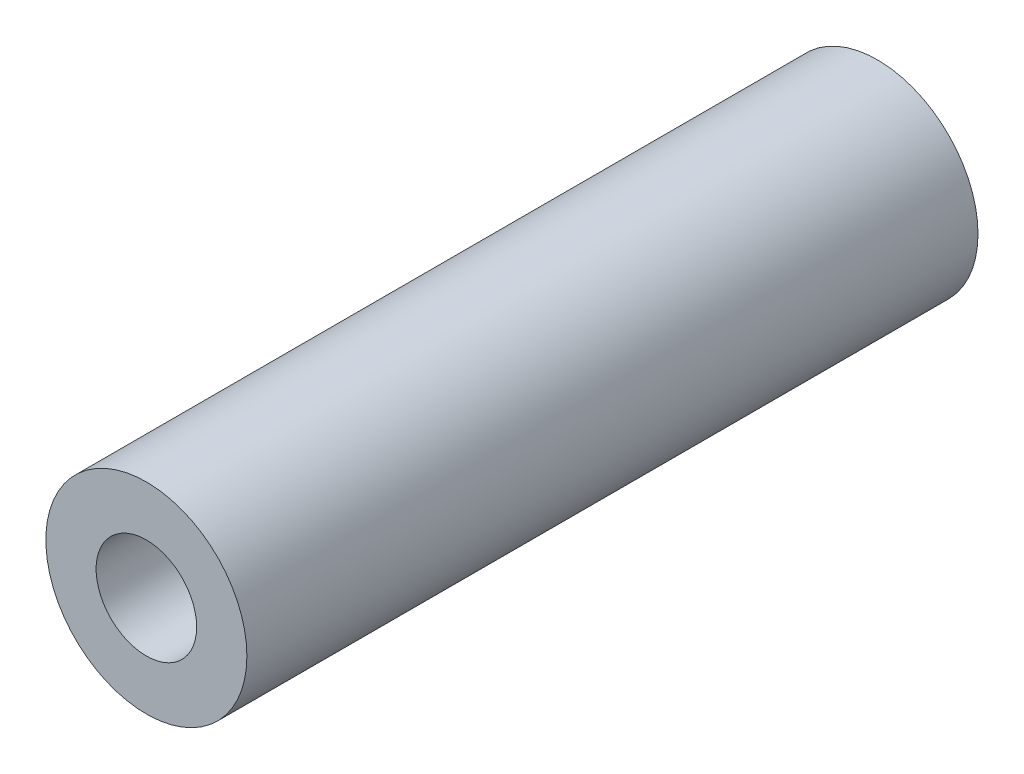
ISO-10303-21;
HEADER;
FILE_DESCRIPTION(('STEP AP214'),'2;1');
FILE_NAME('part.step','',(''),(''),'','','');
FILE_SCHEMA(('AUTOMOTIVE_DESIGN { 1 0 10303 214 1 1 1 1 }'));
ENDSEC;
DATA;
#1=APPLICATION_CONTEXT('core data for automotive mechanical design processes');
#2=APPLICATION_PROTOCOL_DEFINITION('international standard','automotive_design',2000,#1);
#3=PRODUCT_CONTEXT('',#1,'mechanical');
#4=PRODUCT('Part','Part','',(#3));
#5=PRODUCT_RELATED_PRODUCT_CATEGORY('part','',(#4));
#6=PRODUCT_DEFINITION_FORMATION('','',#4);
#7=PRODUCT_DEFINITION_CONTEXT('part definition',#1,'design');
#8=PRODUCT_DEFINITION('design','',#6,#7);
#9=PRODUCT_DEFINITION_SHAPE('','',#8);
#10=(LENGTH_UNIT() NAMED_UNIT(*) SI_UNIT(.MILLI.,.METRE.));
#11=(NAMED_UNIT(*) PLANE_ANGLE_UNIT() SI_UNIT($,.RADIAN.));
#12=(NAMED_UNIT(*) SI_UNIT($,.STERADIAN.) SOLID_ANGLE_UNIT());
#13=UNCERTAINTY_MEASURE_WITH_UNIT(LENGTH_MEASURE(1.E-05),#10,'distance_accuracy_value','');
#14=(GEOMETRIC_REPRESENTATION_CONTEXT(3) GLOBAL_UNCERTAINTY_ASSIGNED_CONTEXT((#13)) GLOBAL_UNIT_ASSIGNED_CONTEXT((#10,
#11,#12)) REPRESENTATION_CONTEXT('',''));
#15=CARTESIAN_POINT('',(0.,0.,0.));
#16=DIRECTION('',(0.,0.,1.));
#17=DIRECTION('',(1.,0.,0.));
#18=AXIS2_PLACEMENT_3D('',#15,#16,#17);
#19=CARTESIAN_POINT('',(0.,0.,80.));
#20=DIRECTION('',(0.,0.,1.));
#21=DIRECTION('',(1.,0.,0.));
#22=AXIS2_PLACEMENT_3D('',#19,#20,#21);
#23=PLANE('',#22);
#24=CARTESIAN_POINT('',(0.,0.,80.));
#25=DIRECTION('',(0.,0.,1.));
#26=DIRECTION('',(1.,0.,0.));
#27=AXIS2_PLACEMENT_3D('',#24,#25,#26);
#28=CIRCLE('',#27,11.);
#29=CARTESIAN_POINT('',(11.,0.,80.));
#30=VERTEX_POINT('',#29);
#31=EDGE_CURVE('E10',#30,#30,#28,.T.);
#32=ORIENTED_EDGE('',*,*,#31,.T.);
#33=EDGE_LOOP('',(#32));
#34=FACE_BOUND('',#33,.T.);
#35=CARTESIAN_POINT('',(0.,0.,80.));
#36=DIRECTION('',(0.,0.,1.));
#37=DIRECTION('',(1.,0.,0.));
#38=AXIS2_PLACEMENT_3D('',#35,#36,#37);
#39=CIRCLE('',#38,5.5);
#40=CARTESIAN_POINT('',(5.5,0.,80.));
#41=VERTEX_POINT('',#40);
#42=EDGE_CURVE('E54',#41,#41,#39,.T.);
#43=ORIENTED_EDGE('',*,*,#42,.F.);
#44=EDGE_LOOP('',(#43));
#45=FACE_BOUND('',#44,.T.);
#46=ADVANCED_FACE('F41',(#34,#45),#23,.T.);
#47=CARTESIAN_POINT('',(0.,0.,0.));
#48=DIRECTION('',(0.,0.,1.));
#49=DIRECTION('',(1.,0.,0.));
#50=AXIS2_PLACEMENT_3D('',#47,#48,#49);
#51=PLANE('',#50);
#52=CARTESIAN_POINT('',(0.,0.,0.));
#53=DIRECTION('',(0.,0.,1.));
#54=DIRECTION('',(1.,0.,0.));
#55=AXIS2_PLACEMENT_3D('',#52,#53,#54);
#56=CIRCLE('',#55,11.);
#57=CARTESIAN_POINT('',(11.,0.,0.));
#58=VERTEX_POINT('',#57);
#59=EDGE_CURVE('E45',#58,#58,#56,.T.);
#60=ORIENTED_EDGE('',*,*,#59,.F.);
#61=EDGE_LOOP('',(#60));
#62=FACE_BOUND('',#61,.T.);
#63=CARTESIAN_POINT('',(0.,0.,0.));
#64=DIRECTION('',(0.,0.,1.));
#65=DIRECTION('',(1.,0.,0.));
#66=AXIS2_PLACEMENT_3D('',#63,#64,#65);
#67=CIRCLE('',#66,5.5);
#68=CARTESIAN_POINT('',(5.5,0.,0.));
#69=VERTEX_POINT('',#68);
#70=EDGE_CURVE('E56',#69,#69,#67,.T.);
#71=ORIENTED_EDGE('',*,*,#70,.T.);
#72=EDGE_LOOP('',(#71));
#73=FACE_BOUND('',#72,.T.);
#74=ADVANCED_FACE('F68',(#62,#73),#51,.F.);
#75=CARTESIAN_POINT('',(0.,0.,80.));
#76=DIRECTION('',(0.,0.,-1.));
#77=DIRECTION('',(-1.,0.,0.));
#78=AXIS2_PLACEMENT_3D('',#75,#76,#77);
#79=CYLINDRICAL_SURFACE('',#78,11.);
#80=ORIENTED_EDGE('',*,*,#31,.F.);
#81=EDGE_LOOP('',(#80));
#82=FACE_BOUND('',#81,.T.);
#83=ORIENTED_EDGE('',*,*,#59,.T.);
#84=EDGE_LOOP('',(#83));
#85=FACE_BOUND('',#84,.T.);
#86=ADVANCED_FACE('F43',(#82,#85),#79,.T.);
#87=CARTESIAN_POINT('',(0.,0.,80.));
#88=DIRECTION('',(0.,0.,-1.));
#89=DIRECTION('',(-1.,0.,0.));
#90=AXIS2_PLACEMENT_3D('',#87,#88,#89);
#91=CYLINDRICAL_SURFACE('',#90,5.5);
#92=ORIENTED_EDGE('',*,*,#42,.T.);
#93=EDGE_LOOP('',(#92));
#94=FACE_BOUND('',#93,.T.);
#95=ORIENTED_EDGE('',*,*,#70,.F.);
#96=EDGE_LOOP('',(#95));
#97=FACE_BOUND('',#96,.T.);
#98=ADVANCED_FACE('F64',(#94,#97),#91,.F.);
#99=CLOSED_SHELL('',(#46,#74,#86,#98));
#100=MANIFOLD_SOLID_BREP('B2',#99);
#101=ADVANCED_BREP_SHAPE_REPRESENTATION('',(#18,#100),#14);
#102=SHAPE_DEFINITION_REPRESENTATION(#9,#101);
ENDSEC;
END-ISO-10303-21;
